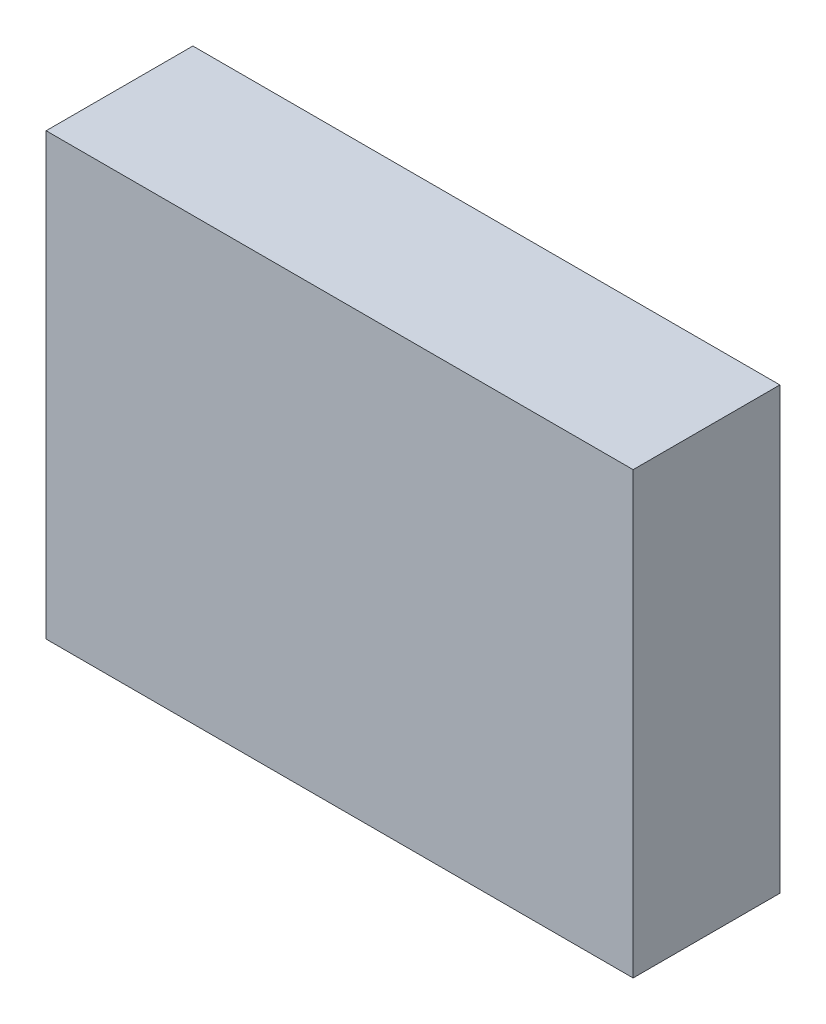
ISO-10303-21;
HEADER;
FILE_DESCRIPTION(('STEP AP214'),'2;1');
FILE_NAME('part.step','',(''),(''),'','','');
FILE_SCHEMA(('AUTOMOTIVE_DESIGN { 1 0 10303 214 1 1 1 1 }'));
ENDSEC;
DATA;
#1=APPLICATION_CONTEXT('core data for automotive mechanical design processes');
#2=APPLICATION_PROTOCOL_DEFINITION('international standard','automotive_design',2000,#1);
#3=PRODUCT_CONTEXT('',#1,'mechanical');
#4=PRODUCT('Part','Part','',(#3));
#5=PRODUCT_RELATED_PRODUCT_CATEGORY('part','',(#4));
#6=PRODUCT_DEFINITION_FORMATION('','',#4);
#7=PRODUCT_DEFINITION_CONTEXT('part definition',#1,'design');
#8=PRODUCT_DEFINITION('design','',#6,#7);
#9=PRODUCT_DEFINITION_SHAPE('','',#8);
#10=(LENGTH_UNIT() NAMED_UNIT(*) SI_UNIT(.MILLI.,.METRE.));
#11=(NAMED_UNIT(*) PLANE_ANGLE_UNIT() SI_UNIT($,.RADIAN.));
#12=(NAMED_UNIT(*) SI_UNIT($,.STERADIAN.) SOLID_ANGLE_UNIT());
#13=UNCERTAINTY_MEASURE_WITH_UNIT(LENGTH_MEASURE(1.E-05),#10,'distance_accuracy_value','');
#14=(GEOMETRIC_REPRESENTATION_CONTEXT(3) GLOBAL_UNCERTAINTY_ASSIGNED_CONTEXT((#13)) GLOBAL_UNIT_ASSIGNED_CONTEXT((#10,
#11,#12)) REPRESENTATION_CONTEXT('',''));
#15=CARTESIAN_POINT('',(0.,0.,0.));
#16=DIRECTION('',(0.,0.,1.));
#17=DIRECTION('',(1.,0.,0.));
#18=AXIS2_PLACEMENT_3D('',#15,#16,#17);
#19=CARTESIAN_POINT('',(0.,0.,10.));
#20=DIRECTION('',(1.,0.,0.));
#21=DIRECTION('',(0.,0.,-1.));
#22=AXIS2_PLACEMENT_3D('',#19,#20,#21);
#23=PLANE('',#22);
#24=DIRECTION('',(0.,-1.,0.));
#25=VECTOR('',#24,1.);
#26=CARTESIAN_POINT('',(0.,0.,0.));
#27=LINE('',#26,#25);
#28=CARTESIAN_POINT('',(0.,30.,0.));
#29=VERTEX_POINT('',#28);
#30=CARTESIAN_POINT('',(0.,0.,0.));
#31=VERTEX_POINT('',#30);
#32=EDGE_CURVE('E105',#29,#31,#27,.T.);
#33=ORIENTED_EDGE('',*,*,#32,.T.);
#34=DIRECTION('',(0.,0.,-1.));
#35=VECTOR('',#34,1.);
#36=CARTESIAN_POINT('',(0.,0.,10.));
#37=LINE('',#36,#35);
#38=CARTESIAN_POINT('',(0.,0.,10.));
#39=VERTEX_POINT('',#38);
#40=EDGE_CURVE('E11',#39,#31,#37,.T.);
#41=ORIENTED_EDGE('',*,*,#40,.F.);
#42=DIRECTION('',(0.,-1.,0.));
#43=VECTOR('',#42,1.);
#44=CARTESIAN_POINT('',(0.,0.,10.));
#45=LINE('',#44,#43);
#46=CARTESIAN_POINT('',(0.,30.,10.));
#47=VERTEX_POINT('',#46);
#48=EDGE_CURVE('E89',#47,#39,#45,.T.);
#49=ORIENTED_EDGE('',*,*,#48,.F.);
#50=DIRECTION('',(0.,0.,-1.));
#51=VECTOR('',#50,1.);
#52=CARTESIAN_POINT('',(0.,30.,10.));
#53=LINE('',#52,#51);
#54=EDGE_CURVE('E97',#47,#29,#53,.T.);
#55=ORIENTED_EDGE('',*,*,#54,.T.);
#56=EDGE_LOOP('',(#33,#41,#49,#55));
#57=FACE_BOUND('',#56,.T.);
#58=ADVANCED_FACE('F39',(#57),#23,.F.);
#59=CARTESIAN_POINT('',(0.,0.,10.));
#60=DIRECTION('',(0.,1.,0.));
#61=DIRECTION('',(0.,0.,1.));
#62=AXIS2_PLACEMENT_3D('',#59,#60,#61);
#63=PLANE('',#62);
#64=DIRECTION('',(1.,0.,0.));
#65=VECTOR('',#64,1.);
#66=CARTESIAN_POINT('',(0.,0.,0.));
#67=LINE('',#66,#65);
#68=CARTESIAN_POINT('',(40.,0.,0.));
#69=VERTEX_POINT('',#68);
#70=EDGE_CURVE('E92',#31,#69,#67,.T.);
#71=ORIENTED_EDGE('',*,*,#70,.T.);
#72=DIRECTION('',(0.,0.,-1.));
#73=VECTOR('',#72,1.);
#74=CARTESIAN_POINT('',(40.,0.,10.));
#75=LINE('',#74,#73);
#76=CARTESIAN_POINT('',(40.,0.,10.));
#77=VERTEX_POINT('',#76);
#78=EDGE_CURVE('E50',#77,#69,#75,.T.);
#79=ORIENTED_EDGE('',*,*,#78,.F.);
#80=DIRECTION('',(1.,0.,0.));
#81=VECTOR('',#80,1.);
#82=CARTESIAN_POINT('',(0.,0.,10.));
#83=LINE('',#82,#81);
#84=EDGE_CURVE('E82',#39,#77,#83,.T.);
#85=ORIENTED_EDGE('',*,*,#84,.F.);
#86=ORIENTED_EDGE('',*,*,#40,.T.);
#87=EDGE_LOOP('',(#71,#79,#85,#86));
#88=FACE_BOUND('',#87,.T.);
#89=ADVANCED_FACE('F93',(#88),#63,.F.);
#90=CARTESIAN_POINT('',(40.,0.,10.));
#91=DIRECTION('',(-1.,0.,0.));
#92=DIRECTION('',(0.,0.,1.));
#93=AXIS2_PLACEMENT_3D('',#90,#91,#92);
#94=PLANE('',#93);
#95=DIRECTION('',(0.,1.,0.));
#96=VECTOR('',#95,1.);
#97=CARTESIAN_POINT('',(40.,0.,0.));
#98=LINE('',#97,#96);
#99=CARTESIAN_POINT('',(40.,30.,0.));
#100=VERTEX_POINT('',#99);
#101=EDGE_CURVE('E72',#69,#100,#98,.T.);
#102=ORIENTED_EDGE('',*,*,#101,.T.);
#103=DIRECTION('',(0.,0.,-1.));
#104=VECTOR('',#103,1.);
#105=CARTESIAN_POINT('',(40.,30.,10.));
#106=LINE('',#105,#104);
#107=CARTESIAN_POINT('',(40.,30.,10.));
#108=VERTEX_POINT('',#107);
#109=EDGE_CURVE('E94',#108,#100,#106,.T.);
#110=ORIENTED_EDGE('',*,*,#109,.F.);
#111=DIRECTION('',(0.,1.,0.));
#112=VECTOR('',#111,1.);
#113=CARTESIAN_POINT('',(40.,0.,10.));
#114=LINE('',#113,#112);
#115=EDGE_CURVE('E88',#77,#108,#114,.T.);
#116=ORIENTED_EDGE('',*,*,#115,.F.);
#117=ORIENTED_EDGE('',*,*,#78,.T.);
#118=EDGE_LOOP('',(#102,#110,#116,#117));
#119=FACE_BOUND('',#118,.T.);
#120=ADVANCED_FACE('F96',(#119),#94,.F.);
#121=CARTESIAN_POINT('',(0.,30.,10.));
#122=DIRECTION('',(0.,-1.,0.));
#123=DIRECTION('',(0.,0.,-1.));
#124=AXIS2_PLACEMENT_3D('',#121,#122,#123);
#125=PLANE('',#124);
#126=DIRECTION('',(-1.,0.,0.));
#127=VECTOR('',#126,1.);
#128=CARTESIAN_POINT('',(0.,30.,0.));
#129=LINE('',#128,#127);
#130=EDGE_CURVE('E76',#100,#29,#129,.T.);
#131=ORIENTED_EDGE('',*,*,#130,.T.);
#132=ORIENTED_EDGE('',*,*,#54,.F.);
#133=DIRECTION('',(-1.,0.,0.));
#134=VECTOR('',#133,1.);
#135=CARTESIAN_POINT('',(0.,30.,10.));
#136=LINE('',#135,#134);
#137=EDGE_CURVE('E54',#108,#47,#136,.T.);
#138=ORIENTED_EDGE('',*,*,#137,.F.);
#139=ORIENTED_EDGE('',*,*,#109,.T.);
#140=EDGE_LOOP('',(#131,#132,#138,#139));
#141=FACE_BOUND('',#140,.T.);
#142=ADVANCED_FACE('F108',(#141),#125,.F.);
#143=CARTESIAN_POINT('',(0.,0.,10.));
#144=DIRECTION('',(0.,0.,-1.));
#145=DIRECTION('',(-1.,0.,0.));
#146=AXIS2_PLACEMENT_3D('',#143,#144,#145);
#147=PLANE('',#146);
#148=ORIENTED_EDGE('',*,*,#48,.T.);
#149=ORIENTED_EDGE('',*,*,#84,.T.);
#150=ORIENTED_EDGE('',*,*,#115,.T.);
#151=ORIENTED_EDGE('',*,*,#137,.T.);
#152=EDGE_LOOP('',(#148,#149,#150,#151));
#153=FACE_BOUND('',#152,.T.);
#154=ADVANCED_FACE('F86',(#153),#147,.F.);
#155=CARTESIAN_POINT('',(0.,0.,0.));
#156=DIRECTION('',(0.,0.,-1.));
#157=DIRECTION('',(-1.,0.,0.));
#158=AXIS2_PLACEMENT_3D('',#155,#156,#157);
#159=PLANE('',#158);
#160=ORIENTED_EDGE('',*,*,#32,.F.);
#161=ORIENTED_EDGE('',*,*,#130,.F.);
#162=ORIENTED_EDGE('',*,*,#101,.F.);
#163=ORIENTED_EDGE('',*,*,#70,.F.);
#164=EDGE_LOOP('',(#160,#161,#162,#163));
#165=FACE_BOUND('',#164,.T.);
#166=ADVANCED_FACE('F115',(#165),#159,.T.);
#167=CLOSED_SHELL('',(#58,#89,#120,#142,#154,#166));
#168=MANIFOLD_SOLID_BREP('B2',#167);
#169=ADVANCED_BREP_SHAPE_REPRESENTATION('',(#18,#168),#14);
#170=SHAPE_DEFINITION_REPRESENTATION(#9,#169);
ENDSEC;
END-ISO-10303-21;
